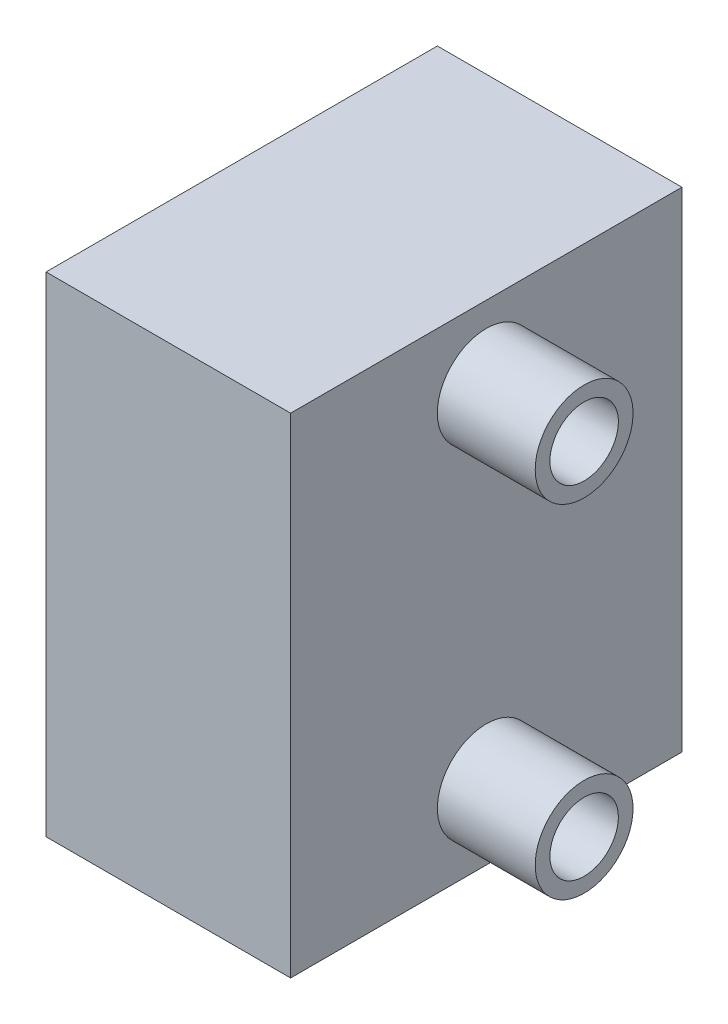
ISO-10303-21;
HEADER;
FILE_DESCRIPTION(('STEP AP214'),'2;1');
FILE_NAME('part.step','',(''),(''),'','','');
FILE_SCHEMA(('AUTOMOTIVE_DESIGN { 1 0 10303 214 1 1 1 1 }'));
ENDSEC;
DATA;
#1=APPLICATION_CONTEXT('core data for automotive mechanical design processes');
#2=APPLICATION_PROTOCOL_DEFINITION('international standard','automotive_design',2000,#1);
#3=PRODUCT_CONTEXT('',#1,'mechanical');
#4=PRODUCT('Part','Part','',(#3));
#5=PRODUCT_RELATED_PRODUCT_CATEGORY('part','',(#4));
#6=PRODUCT_DEFINITION_FORMATION('','',#4);
#7=PRODUCT_DEFINITION_CONTEXT('part definition',#1,'design');
#8=PRODUCT_DEFINITION('design','',#6,#7);
#9=PRODUCT_DEFINITION_SHAPE('','',#8);
#10=(LENGTH_UNIT() NAMED_UNIT(*) SI_UNIT(.MILLI.,.METRE.));
#11=(NAMED_UNIT(*) PLANE_ANGLE_UNIT() SI_UNIT($,.RADIAN.));
#12=(NAMED_UNIT(*) SI_UNIT($,.STERADIAN.) SOLID_ANGLE_UNIT());
#13=UNCERTAINTY_MEASURE_WITH_UNIT(LENGTH_MEASURE(1.E-05),#10,'distance_accuracy_value','');
#14=(GEOMETRIC_REPRESENTATION_CONTEXT(3) GLOBAL_UNCERTAINTY_ASSIGNED_CONTEXT((#13)) GLOBAL_UNIT_ASSIGNED_CONTEXT((#10,
#11,#12)) REPRESENTATION_CONTEXT('',''));
#15=CARTESIAN_POINT('',(0.,0.,0.));
#16=DIRECTION('',(0.,0.,1.));
#17=DIRECTION('',(1.,0.,0.));
#18=AXIS2_PLACEMENT_3D('',#15,#16,#17);
#19=CARTESIAN_POINT('',(50.,-50.,-40.));
#20=DIRECTION('',(0.,1.,0.));
#21=DIRECTION('',(0.,0.,1.));
#22=AXIS2_PLACEMENT_3D('',#19,#20,#21);
#23=PLANE('',#22);
#24=DIRECTION('',(0.,0.,-1.));
#25=VECTOR('',#24,1.);
#26=CARTESIAN_POINT('',(0.,-50.,-40.));
#27=LINE('',#26,#25);
#28=CARTESIAN_POINT('',(0.,-50.,40.));
#29=VERTEX_POINT('',#28);
#30=CARTESIAN_POINT('',(0.,-50.,-40.));
#31=VERTEX_POINT('',#30);
#32=EDGE_CURVE('E106',#29,#31,#27,.T.);
#33=ORIENTED_EDGE('',*,*,#32,.T.);
#34=DIRECTION('',(-1.,0.,0.));
#35=VECTOR('',#34,1.);
#36=CARTESIAN_POINT('',(50.,-50.,-40.));
#37=LINE('',#36,#35);
#38=CARTESIAN_POINT('',(50.,-50.,-40.));
#39=VERTEX_POINT('',#38);
#40=EDGE_CURVE('E46',#39,#31,#37,.T.);
#41=ORIENTED_EDGE('',*,*,#40,.F.);
#42=DIRECTION('',(0.,0.,-1.));
#43=VECTOR('',#42,1.);
#44=CARTESIAN_POINT('',(50.,-50.,-40.));
#45=LINE('',#44,#43);
#46=CARTESIAN_POINT('',(50.,-50.,40.));
#47=VERTEX_POINT('',#46);
#48=EDGE_CURVE('E100',#47,#39,#45,.T.);
#49=ORIENTED_EDGE('',*,*,#48,.F.);
#50=DIRECTION('',(-1.,0.,0.));
#51=VECTOR('',#50,1.);
#52=CARTESIAN_POINT('',(50.,-50.,40.));
#53=LINE('',#52,#51);
#54=EDGE_CURVE('E107',#47,#29,#53,.T.);
#55=ORIENTED_EDGE('',*,*,#54,.T.);
#56=EDGE_LOOP('',(#33,#41,#49,#55));
#57=FACE_BOUND('',#56,.T.);
#58=ADVANCED_FACE('F43',(#57),#23,.F.);
#59=CARTESIAN_POINT('',(50.,50.,-40.));
#60=DIRECTION('',(0.,0.,1.));
#61=DIRECTION('',(0.,-1.,0.));
#62=AXIS2_PLACEMENT_3D('',#59,#60,#61);
#63=PLANE('',#62);
#64=DIRECTION('',(0.,1.,0.));
#65=VECTOR('',#64,1.);
#66=CARTESIAN_POINT('',(0.,50.,-40.));
#67=LINE('',#66,#65);
#68=CARTESIAN_POINT('',(0.,50.,-40.));
#69=VERTEX_POINT('',#68);
#70=EDGE_CURVE('E105',#31,#69,#67,.T.);
#71=ORIENTED_EDGE('',*,*,#70,.T.);
#72=DIRECTION('',(-1.,0.,0.));
#73=VECTOR('',#72,1.);
#74=CARTESIAN_POINT('',(50.,50.,-40.));
#75=LINE('',#74,#73);
#76=CARTESIAN_POINT('',(50.,50.,-40.));
#77=VERTEX_POINT('',#76);
#78=EDGE_CURVE('E99',#77,#69,#75,.T.);
#79=ORIENTED_EDGE('',*,*,#78,.F.);
#80=DIRECTION('',(0.,1.,0.));
#81=VECTOR('',#80,1.);
#82=CARTESIAN_POINT('',(50.,50.,-40.));
#83=LINE('',#82,#81);
#84=EDGE_CURVE('E95',#39,#77,#83,.T.);
#85=ORIENTED_EDGE('',*,*,#84,.F.);
#86=ORIENTED_EDGE('',*,*,#40,.T.);
#87=EDGE_LOOP('',(#71,#79,#85,#86));
#88=FACE_BOUND('',#87,.T.);
#89=ADVANCED_FACE('F102',(#88),#63,.F.);
#90=CARTESIAN_POINT('',(50.,50.,-40.));
#91=DIRECTION('',(0.,-1.,0.));
#92=DIRECTION('',(0.,0.,-1.));
#93=AXIS2_PLACEMENT_3D('',#90,#91,#92);
#94=PLANE('',#93);
#95=DIRECTION('',(0.,0.,1.));
#96=VECTOR('',#95,1.);
#97=CARTESIAN_POINT('',(0.,50.,-40.));
#98=LINE('',#97,#96);
#99=CARTESIAN_POINT('',(0.,50.,40.));
#100=VERTEX_POINT('',#99);
#101=EDGE_CURVE('E76',#69,#100,#98,.T.);
#102=ORIENTED_EDGE('',*,*,#101,.T.);
#103=DIRECTION('',(-1.,0.,0.));
#104=VECTOR('',#103,1.);
#105=CARTESIAN_POINT('',(50.,50.,40.));
#106=LINE('',#105,#104);
#107=CARTESIAN_POINT('',(50.,50.,40.));
#108=VERTEX_POINT('',#107);
#109=EDGE_CURVE('E104',#108,#100,#106,.T.);
#110=ORIENTED_EDGE('',*,*,#109,.F.);
#111=DIRECTION('',(0.,0.,1.));
#112=VECTOR('',#111,1.);
#113=CARTESIAN_POINT('',(50.,50.,-40.));
#114=LINE('',#113,#112);
#115=EDGE_CURVE('E94',#77,#108,#114,.T.);
#116=ORIENTED_EDGE('',*,*,#115,.F.);
#117=ORIENTED_EDGE('',*,*,#78,.T.);
#118=EDGE_LOOP('',(#102,#110,#116,#117));
#119=FACE_BOUND('',#118,.T.);
#120=ADVANCED_FACE('F101',(#119),#94,.F.);
#121=CARTESIAN_POINT('',(50.,50.,40.));
#122=DIRECTION('',(0.,0.,-1.));
#123=DIRECTION('',(0.,1.,0.));
#124=AXIS2_PLACEMENT_3D('',#121,#122,#123);
#125=PLANE('',#124);
#126=DIRECTION('',(0.,-1.,0.));
#127=VECTOR('',#126,1.);
#128=CARTESIAN_POINT('',(0.,50.,40.));
#129=LINE('',#128,#127);
#130=EDGE_CURVE('E84',#100,#29,#129,.T.);
#131=ORIENTED_EDGE('',*,*,#130,.T.);
#132=ORIENTED_EDGE('',*,*,#54,.F.);
#133=DIRECTION('',(0.,-1.,0.));
#134=VECTOR('',#133,1.);
#135=CARTESIAN_POINT('',(50.,50.,40.));
#136=LINE('',#135,#134);
#137=EDGE_CURVE('E62',#108,#47,#136,.T.);
#138=ORIENTED_EDGE('',*,*,#137,.F.);
#139=ORIENTED_EDGE('',*,*,#109,.T.);
#140=EDGE_LOOP('',(#131,#132,#138,#139));
#141=FACE_BOUND('',#140,.T.);
#142=ADVANCED_FACE('F118',(#141),#125,.F.);
#143=CARTESIAN_POINT('',(50.,0.,0.));
#144=DIRECTION('',(1.,0.,0.));
#145=DIRECTION('',(0.,0.,-1.));
#146=AXIS2_PLACEMENT_3D('',#143,#144,#145);
#147=PLANE('',#146);
#148=CARTESIAN_POINT('',(50.,-35.,0.));
#149=DIRECTION('',(1.,0.,0.));
#150=DIRECTION('',(0.,0.,-1.));
#151=AXIS2_PLACEMENT_3D('',#148,#149,#150);
#152=CIRCLE('',#151,10.);
#153=CARTESIAN_POINT('',(50.,-35.,-10.));
#154=VERTEX_POINT('',#153);
#155=EDGE_CURVE('E11',#154,#154,#152,.T.);
#156=ORIENTED_EDGE('',*,*,#155,.F.);
#157=EDGE_LOOP('',(#156));
#158=FACE_BOUND('',#157,.T.);
#159=CARTESIAN_POINT('',(50.,35.,0.));
#160=DIRECTION('',(1.,0.,0.));
#161=DIRECTION('',(0.,0.,1.));
#162=AXIS2_PLACEMENT_3D('',#159,#160,#161);
#163=CIRCLE('',#162,10.);
#164=CARTESIAN_POINT('',(50.,35.,9.99999999999997));
#165=VERTEX_POINT('',#164);
#166=EDGE_CURVE('E55',#165,#165,#163,.T.);
#167=ORIENTED_EDGE('',*,*,#166,.F.);
#168=EDGE_LOOP('',(#167));
#169=FACE_BOUND('',#168,.T.);
#170=ORIENTED_EDGE('',*,*,#48,.T.);
#171=ORIENTED_EDGE('',*,*,#84,.T.);
#172=ORIENTED_EDGE('',*,*,#115,.T.);
#173=ORIENTED_EDGE('',*,*,#137,.T.);
#174=EDGE_LOOP('',(#170,#171,#172,#173));
#175=FACE_BOUND('',#174,.T.);
#176=ADVANCED_FACE('F93',(#158,#169,#175),#147,.T.);
#177=CARTESIAN_POINT('',(0.,0.,0.));
#178=DIRECTION('',(1.,0.,0.));
#179=DIRECTION('',(0.,0.,-1.));
#180=AXIS2_PLACEMENT_3D('',#177,#178,#179);
#181=PLANE('',#180);
#182=ORIENTED_EDGE('',*,*,#32,.F.);
#183=ORIENTED_EDGE('',*,*,#130,.F.);
#184=ORIENTED_EDGE('',*,*,#101,.F.);
#185=ORIENTED_EDGE('',*,*,#70,.F.);
#186=EDGE_LOOP('',(#182,#183,#184,#185));
#187=FACE_BOUND('',#186,.T.);
#188=ADVANCED_FACE('F123',(#187),#181,.F.);
#189=CARTESIAN_POINT('',(70.,35.,0.));
#190=DIRECTION('',(-1.,0.,0.));
#191=DIRECTION('',(0.,0.,1.));
#192=AXIS2_PLACEMENT_3D('',#189,#190,#191);
#193=PLANE('',#192);
#194=CARTESIAN_POINT('',(70.,35.,0.));
#195=DIRECTION('',(1.,0.,0.));
#196=DIRECTION('',(0.,0.,1.));
#197=AXIS2_PLACEMENT_3D('',#194,#195,#196);
#198=CIRCLE('',#197,10.);
#199=CARTESIAN_POINT('',(70.,35.,9.99999999999997));
#200=VERTEX_POINT('',#199);
#201=EDGE_CURVE('E126',#200,#200,#198,.T.);
#202=ORIENTED_EDGE('',*,*,#201,.T.);
#203=EDGE_LOOP('',(#202));
#204=FACE_BOUND('',#203,.T.);
#205=CARTESIAN_POINT('',(70.,35.,0.));
#206=DIRECTION('',(1.,0.,0.));
#207=DIRECTION('',(0.,0.,1.));
#208=AXIS2_PLACEMENT_3D('',#205,#206,#207);
#209=CIRCLE('',#208,7.);
#210=CARTESIAN_POINT('',(70.,35.,6.99999999999996));
#211=VERTEX_POINT('',#210);
#212=EDGE_CURVE('E125',#211,#211,#209,.T.);
#213=ORIENTED_EDGE('',*,*,#212,.F.);
#214=EDGE_LOOP('',(#213));
#215=FACE_BOUND('',#214,.T.);
#216=ADVANCED_FACE('F176',(#204,#215),#193,.F.);
#217=CARTESIAN_POINT('',(70.,35.,0.));
#218=DIRECTION('',(-1.,0.,0.));
#219=DIRECTION('',(0.,0.,1.));
#220=AXIS2_PLACEMENT_3D('',#217,#218,#219);
#221=CYLINDRICAL_SURFACE('',#220,10.);
#222=ORIENTED_EDGE('',*,*,#201,.F.);
#223=EDGE_LOOP('',(#222));
#224=FACE_BOUND('',#223,.T.);
#225=ORIENTED_EDGE('',*,*,#166,.T.);
#226=EDGE_LOOP('',(#225));
#227=FACE_BOUND('',#226,.T.);
#228=ADVANCED_FACE('F159',(#224,#227),#221,.T.);
#229=CARTESIAN_POINT('',(70.,35.,0.));
#230=DIRECTION('',(-1.,0.,0.));
#231=DIRECTION('',(0.,0.,1.));
#232=AXIS2_PLACEMENT_3D('',#229,#230,#231);
#233=CYLINDRICAL_SURFACE('',#232,7.);
#234=ORIENTED_EDGE('',*,*,#212,.T.);
#235=EDGE_LOOP('',(#234));
#236=FACE_BOUND('',#235,.T.);
#237=CARTESIAN_POINT('',(50.,35.,0.));
#238=DIRECTION('',(1.,0.,0.));
#239=DIRECTION('',(0.,0.,1.));
#240=AXIS2_PLACEMENT_3D('',#237,#238,#239);
#241=CIRCLE('',#240,7.);
#242=CARTESIAN_POINT('',(50.,35.,6.99999999999996));
#243=VERTEX_POINT('',#242);
#244=EDGE_CURVE('E130',#243,#243,#241,.T.);
#245=ORIENTED_EDGE('',*,*,#244,.F.);
#246=EDGE_LOOP('',(#245));
#247=FACE_BOUND('',#246,.T.);
#248=ADVANCED_FACE('F148',(#236,#247),#233,.F.);
#249=CARTESIAN_POINT('',(70.,-35.,0.));
#250=DIRECTION('',(1.,0.,0.));
#251=DIRECTION('',(0.,0.,-1.));
#252=AXIS2_PLACEMENT_3D('',#249,#250,#251);
#253=PLANE('',#252);
#254=CARTESIAN_POINT('',(70.,-35.,0.));
#255=DIRECTION('',(1.,0.,0.));
#256=DIRECTION('',(0.,0.,-1.));
#257=AXIS2_PLACEMENT_3D('',#254,#255,#256);
#258=CIRCLE('',#257,10.);
#259=CARTESIAN_POINT('',(70.,-35.,-10.));
#260=VERTEX_POINT('',#259);
#261=EDGE_CURVE('E111',#260,#260,#258,.T.);
#262=ORIENTED_EDGE('',*,*,#261,.T.);
#263=EDGE_LOOP('',(#262));
#264=FACE_BOUND('',#263,.T.);
#265=CARTESIAN_POINT('',(70.,-35.,0.));
#266=DIRECTION('',(1.,0.,0.));
#267=DIRECTION('',(0.,0.,-1.));
#268=AXIS2_PLACEMENT_3D('',#265,#266,#267);
#269=CIRCLE('',#268,7.);
#270=CARTESIAN_POINT('',(70.,-35.,-7.));
#271=VERTEX_POINT('',#270);
#272=EDGE_CURVE('E138',#271,#271,#269,.T.);
#273=ORIENTED_EDGE('',*,*,#272,.F.);
#274=EDGE_LOOP('',(#273));
#275=FACE_BOUND('',#274,.T.);
#276=ADVANCED_FACE('F150',(#264,#275),#253,.T.);
#277=CARTESIAN_POINT('',(70.,-35.,0.));
#278=DIRECTION('',(-1.,0.,0.));
#279=DIRECTION('',(0.,0.,1.));
#280=AXIS2_PLACEMENT_3D('',#277,#278,#279);
#281=CYLINDRICAL_SURFACE('',#280,10.);
#282=ORIENTED_EDGE('',*,*,#261,.F.);
#283=EDGE_LOOP('',(#282));
#284=FACE_BOUND('',#283,.T.);
#285=ORIENTED_EDGE('',*,*,#155,.T.);
#286=EDGE_LOOP('',(#285));
#287=FACE_BOUND('',#286,.T.);
#288=ADVANCED_FACE('F146',(#284,#287),#281,.T.);
#289=CARTESIAN_POINT('',(70.,-35.,0.));
#290=DIRECTION('',(-1.,0.,0.));
#291=DIRECTION('',(0.,0.,1.));
#292=AXIS2_PLACEMENT_3D('',#289,#290,#291);
#293=CYLINDRICAL_SURFACE('',#292,7.);
#294=ORIENTED_EDGE('',*,*,#272,.T.);
#295=EDGE_LOOP('',(#294));
#296=FACE_BOUND('',#295,.T.);
#297=CARTESIAN_POINT('',(50.,-35.,0.));
#298=DIRECTION('',(1.,0.,0.));
#299=DIRECTION('',(0.,0.,-1.));
#300=AXIS2_PLACEMENT_3D('',#297,#298,#299);
#301=CIRCLE('',#300,7.);
#302=CARTESIAN_POINT('',(50.,-35.,-7.));
#303=VERTEX_POINT('',#302);
#304=EDGE_CURVE('E131',#303,#303,#301,.T.);
#305=ORIENTED_EDGE('',*,*,#304,.F.);
#306=EDGE_LOOP('',(#305));
#307=FACE_BOUND('',#306,.T.);
#308=ADVANCED_FACE('F143',(#296,#307),#293,.F.);
#309=ORIENTED_EDGE('',*,*,#244,.T.);
#310=EDGE_LOOP('',(#309));
#311=FACE_BOUND('',#310,.T.);
#312=ADVANCED_FACE('F179',(#311),#147,.T.);
#313=ORIENTED_EDGE('',*,*,#304,.T.);
#314=EDGE_LOOP('',(#313));
#315=FACE_BOUND('',#314,.T.);
#316=ADVANCED_FACE('F177',(#315),#147,.T.);
#317=CLOSED_SHELL('',(#58,#89,#120,#142,#176,#188,#216,#228,#248,#276,#288,#308,#312,#316));
#318=MANIFOLD_SOLID_BREP('B2',#317);
#319=ADVANCED_BREP_SHAPE_REPRESENTATION('',(#18,#318),#14);
#320=SHAPE_DEFINITION_REPRESENTATION(#9,#319);
ENDSEC;
END-ISO-10303-21;
